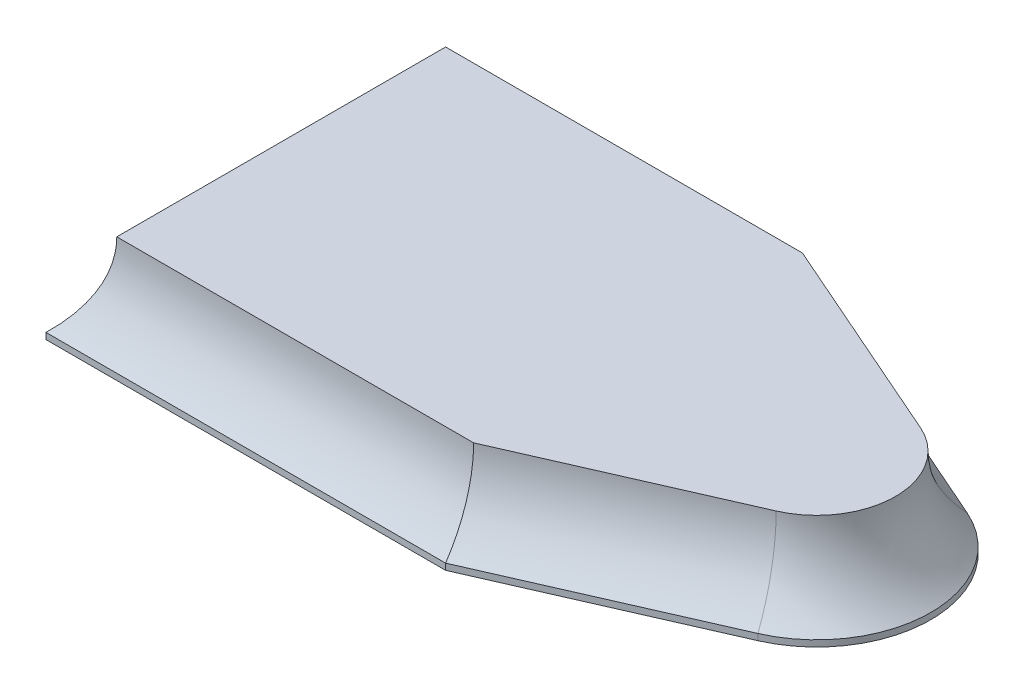
ISO-10303-21;
HEADER;
FILE_DESCRIPTION(('STEP AP214'),'2;1');
FILE_NAME('part.step','',(''),(''),'','','');
FILE_SCHEMA(('AUTOMOTIVE_DESIGN { 1 0 10303 214 1 1 1 1 }'));
ENDSEC;
DATA;
#1=APPLICATION_CONTEXT('core data for automotive mechanical design processes');
#2=APPLICATION_PROTOCOL_DEFINITION('international standard','automotive_design',2000,#1);
#3=PRODUCT_CONTEXT('',#1,'mechanical');
#4=PRODUCT('Part','Part','',(#3));
#5=PRODUCT_RELATED_PRODUCT_CATEGORY('part','',(#4));
#6=PRODUCT_DEFINITION_FORMATION('','',#4);
#7=PRODUCT_DEFINITION_CONTEXT('part definition',#1,'design');
#8=PRODUCT_DEFINITION('design','',#6,#7);
#9=PRODUCT_DEFINITION_SHAPE('','',#8);
#10=(LENGTH_UNIT() NAMED_UNIT(*) SI_UNIT(.MILLI.,.METRE.));
#11=(NAMED_UNIT(*) PLANE_ANGLE_UNIT() SI_UNIT($,.RADIAN.));
#12=(NAMED_UNIT(*) SI_UNIT($,.STERADIAN.) SOLID_ANGLE_UNIT());
#13=UNCERTAINTY_MEASURE_WITH_UNIT(LENGTH_MEASURE(1.E-05),#10,'distance_accuracy_value','');
#14=(GEOMETRIC_REPRESENTATION_CONTEXT(3) GLOBAL_UNCERTAINTY_ASSIGNED_CONTEXT((#13)) GLOBAL_UNIT_ASSIGNED_CONTEXT((#10,
#11,#12)) REPRESENTATION_CONTEXT('',''));
#15=CARTESIAN_POINT('',(0.,0.,0.));
#16=DIRECTION('',(0.,0.,1.));
#17=DIRECTION('',(1.,0.,0.));
#18=AXIS2_PLACEMENT_3D('',#15,#16,#17);
#19=CARTESIAN_POINT('',(7.,0.,-7.));
#20=DIRECTION('',(0.,0.,-1.));
#21=DIRECTION('',(-1.,0.,0.));
#22=AXIS2_PLACEMENT_3D('',#19,#20,#21);
#23=PLANE('',#22);
#24=DIRECTION('',(0.,-1.,0.));
#25=VECTOR('',#24,1.);
#26=CARTESIAN_POINT('',(0.,0.,-7.));
#27=LINE('',#26,#25);
#28=CARTESIAN_POINT('',(0.,0.11,-7.));
#29=VERTEX_POINT('',#28);
#30=CARTESIAN_POINT('',(0.,0.,-7.));
#31=VERTEX_POINT('',#30);
#32=EDGE_CURVE('E179',#29,#31,#27,.T.);
#33=ORIENTED_EDGE('',*,*,#32,.F.);
#34=DIRECTION('',(-1.,0.,0.));
#35=VECTOR('',#34,1.);
#36=CARTESIAN_POINT('',(7.,0.11,-7.));
#37=LINE('',#36,#35);
#38=CARTESIAN_POINT('',(7.,0.11,-7.));
#39=VERTEX_POINT('',#38);
#40=EDGE_CURVE('E144',#39,#29,#37,.T.);
#41=ORIENTED_EDGE('',*,*,#40,.F.);
#42=DIRECTION('',(0.,-1.,0.));
#43=VECTOR('',#42,1.);
#44=CARTESIAN_POINT('',(7.,0.,-7.));
#45=LINE('',#44,#43);
#46=CARTESIAN_POINT('',(7.,0.,-7.));
#47=VERTEX_POINT('',#46);
#48=EDGE_CURVE('E301',#39,#47,#45,.T.);
#49=ORIENTED_EDGE('',*,*,#48,.T.);
#50=DIRECTION('',(-1.,0.,0.));
#51=VECTOR('',#50,1.);
#52=CARTESIAN_POINT('',(7.,0.,-7.));
#53=LINE('',#52,#51);
#54=EDGE_CURVE('E174',#47,#31,#53,.T.);
#55=ORIENTED_EDGE('',*,*,#54,.T.);
#56=EDGE_LOOP('',(#33,#41,#49,#55));
#57=FACE_BOUND('',#56,.T.);
#58=ADVANCED_FACE('F39',(#57),#23,.T.);
#59=CARTESIAN_POINT('',(7.,0.,-7.));
#60=DIRECTION('',(0.,-1.,0.));
#61=DIRECTION('',(0.,0.,-1.));
#62=AXIS2_PLACEMENT_3D('',#59,#60,#61);
#63=PLANE('',#62);
#64=DIRECTION('',(-1.,0.,0.));
#65=VECTOR('',#64,1.);
#66=CARTESIAN_POINT('',(7.,0.,-6.56));
#67=LINE('',#66,#65);
#68=CARTESIAN_POINT('',(6.90773504548328,0.,-6.56));
#69=VERTEX_POINT('',#68);
#70=CARTESIAN_POINT('',(0.440000000000002,0.,-6.56));
#71=VERTEX_POINT('',#70);
#72=EDGE_CURVE('E177',#69,#71,#67,.T.);
#73=ORIENTED_EDGE('',*,*,#72,.T.);
#74=DIRECTION('',(-0.707106781186548,0.,-0.707106781186548));
#75=VECTOR('',#74,1.);
#76=CARTESIAN_POINT('',(0.,0.,-7.));
#77=LINE('',#76,#75);
#78=EDGE_CURVE('E167',#71,#31,#77,.T.);
#79=ORIENTED_EDGE('',*,*,#78,.T.);
#80=ORIENTED_EDGE('',*,*,#54,.F.);
#81=DIRECTION('',(0.205229524628797,0.,-0.978713871476561));
#82=VECTOR('',#81,1.);
#83=CARTESIAN_POINT('',(6.82506599945197,0.,-6.16576168444128));
#84=LINE('',#83,#82);
#85=EDGE_CURVE('E251',#69,#47,#84,.T.);
#86=ORIENTED_EDGE('',*,*,#85,.F.);
#87=EDGE_LOOP('',(#73,#79,#80,#86));
#88=FACE_BOUND('',#87,.T.);
#89=ADVANCED_FACE('F596',(#88),#63,.T.);
#90=CARTESIAN_POINT('',(7.,0.,-6.56));
#91=DIRECTION('',(0.,-0.365652372422994,0.930751493440347));
#92=DIRECTION('',(0.,-0.930751493440347,-0.365652372422994));
#93=AXIS2_PLACEMENT_3D('',#90,#91,#92);
#94=PLANE('',#93);
#95=DIRECTION('',(-1.,0.,0.));
#96=VECTOR('',#95,1.);
#97=CARTESIAN_POINT('',(7.,1.12,-6.12));
#98=LINE('',#97,#96);
#99=CARTESIAN_POINT('',(6.81547009096655,1.12,-6.12));
#100=VERTEX_POINT('',#99);
#101=CARTESIAN_POINT('',(0.880000000000001,1.12,-6.12));
#102=VERTEX_POINT('',#101);
#103=EDGE_CURVE('E154',#100,#102,#98,.T.);
#104=ORIENTED_EDGE('',*,*,#103,.T.);
#105=DIRECTION('',(-0.343414797579954,-0.874146757476248,-0.343414797579954));
#106=VECTOR('',#105,1.);
#107=CARTESIAN_POINT('',(0.388109161793373,-0.132085769980507,-6.61189083820663));
#108=LINE('',#107,#106);
#109=EDGE_CURVE('E187',#102,#71,#108,.T.);
#110=ORIENTED_EDGE('',*,*,#109,.T.);
#111=ORIENTED_EDGE('',*,*,#72,.F.);
#112=DIRECTION('',(0.0764503742779721,-0.928027544584215,-0.364582249658085));
#113=VECTOR('',#112,1.);
#114=CARTESIAN_POINT('',(6.8839996077667,0.288123376658069,-6.44680867345576));
#115=LINE('',#114,#113);
#116=EDGE_CURVE('E189',#100,#69,#115,.T.);
#117=ORIENTED_EDGE('',*,*,#116,.F.);
#118=EDGE_LOOP('',(#104,#110,#111,#117));
#119=FACE_BOUND('',#118,.T.);
#120=ADVANCED_FACE('F185',(#119),#94,.T.);
#121=CARTESIAN_POINT('',(7.,1.55762008419297,-8.37999858399968));
#122=DIRECTION('',(-1.,0.,0.));
#123=DIRECTION('',(0.,0.,1.));
#124=AXIS2_PLACEMENT_3D('',#121,#122,#123);
#125=CYLINDRICAL_SURFACE('',#124,2.);
#126=ORIENTED_EDGE('',*,*,#40,.T.);
#127=CARTESIAN_POINT('',(-1.37999858399969,1.55762008419297,-8.37999858399968));
#128=DIRECTION('',(-0.707106781186547,0.,0.707106781186547));
#129=DIRECTION('',(0.707106781186548,0.,0.707106781186548));
#130=AXIS2_PLACEMENT_3D('',#127,#128,#129);
#131=ELLIPSE('',#130,2.82842712474619,2.);
#132=CARTESIAN_POINT('',(0.620000000000001,1.56,-6.38));
#133=VERTEX_POINT('',#132);
#134=EDGE_CURVE('E141',#29,#133,#131,.T.);
#135=ORIENTED_EDGE('',*,*,#134,.T.);
#136=DIRECTION('',(-1.,0.,0.));
#137=VECTOR('',#136,1.);
#138=CARTESIAN_POINT('',(7.,1.56,-6.38));
#139=LINE('',#138,#137);
#140=CARTESIAN_POINT('',(6.8699902913628,1.56,-6.38));
#141=VERTEX_POINT('',#140);
#142=EDGE_CURVE('E43',#141,#133,#139,.T.);
#143=ORIENTED_EDGE('',*,*,#142,.F.);
#144=CARTESIAN_POINT('',(7.28937615133153,1.55762008419297,-8.37999858399969));
#145=DIRECTION('',(-0.978713871476561,0.,-0.205229524628797));
#146=DIRECTION('',(0.205229524628797,0.,-0.978713871476561));
#147=AXIS2_PLACEMENT_3D('',#144,#145,#146);
#148=ELLIPSE('',#147,2.04349816456841,2.);
#149=EDGE_CURVE('E149',#39,#141,#148,.T.);
#150=ORIENTED_EDGE('',*,*,#149,.F.);
#151=EDGE_LOOP('',(#126,#135,#143,#150));
#152=FACE_BOUND('',#151,.T.);
#153=ADVANCED_FACE('F41',(#152),#125,.F.);
#154=CARTESIAN_POINT('',(0.,0.,-7.));
#155=DIRECTION('',(-1.,0.,0.));
#156=DIRECTION('',(0.,0.,1.));
#157=AXIS2_PLACEMENT_3D('',#154,#155,#156);
#158=PLANE('',#157);
#159=DIRECTION('',(0.,-1.,0.));
#160=VECTOR('',#159,1.);
#161=CARTESIAN_POINT('',(0.,0.,0.));
#162=LINE('',#161,#160);
#163=CARTESIAN_POINT('',(0.,0.11,0.));
#164=VERTEX_POINT('',#163);
#165=CARTESIAN_POINT('',(0.,0.,0.));
#166=VERTEX_POINT('',#165);
#167=EDGE_CURVE('E223',#164,#166,#162,.T.);
#168=ORIENTED_EDGE('',*,*,#167,.F.);
#169=DIRECTION('',(0.,0.,1.));
#170=VECTOR('',#169,1.);
#171=CARTESIAN_POINT('',(0.,0.11,-7.));
#172=LINE('',#171,#170);
#173=EDGE_CURVE('E164',#29,#164,#172,.T.);
#174=ORIENTED_EDGE('',*,*,#173,.F.);
#175=ORIENTED_EDGE('',*,*,#32,.T.);
#176=DIRECTION('',(0.,0.,1.));
#177=VECTOR('',#176,1.);
#178=CARTESIAN_POINT('',(0.,0.,-7.));
#179=LINE('',#178,#177);
#180=EDGE_CURVE('E324',#31,#166,#179,.T.);
#181=ORIENTED_EDGE('',*,*,#180,.T.);
#182=EDGE_LOOP('',(#168,#174,#175,#181));
#183=FACE_BOUND('',#182,.T.);
#184=ADVANCED_FACE('F386',(#183),#158,.T.);
#185=CARTESIAN_POINT('',(0.,0.,-7.));
#186=DIRECTION('',(0.,-1.,0.));
#187=DIRECTION('',(0.,0.,-1.));
#188=AXIS2_PLACEMENT_3D('',#185,#186,#187);
#189=PLANE('',#188);
#190=DIRECTION('',(0.,0.,1.));
#191=VECTOR('',#190,1.);
#192=CARTESIAN_POINT('',(0.440000000000001,0.,-7.));
#193=LINE('',#192,#191);
#194=CARTESIAN_POINT('',(0.440000000000001,0.,-0.440000000000002));
#195=VERTEX_POINT('',#194);
#196=EDGE_CURVE('E170',#71,#195,#193,.T.);
#197=ORIENTED_EDGE('',*,*,#196,.T.);
#198=DIRECTION('',(-0.707106781186548,0.,0.707106781186548));
#199=VECTOR('',#198,1.);
#200=CARTESIAN_POINT('',(0.,0.,0.));
#201=LINE('',#200,#199);
#202=EDGE_CURVE('E216',#195,#166,#201,.T.);
#203=ORIENTED_EDGE('',*,*,#202,.T.);
#204=ORIENTED_EDGE('',*,*,#180,.F.);
#205=ORIENTED_EDGE('',*,*,#78,.F.);
#206=EDGE_LOOP('',(#197,#203,#204,#205));
#207=FACE_BOUND('',#206,.T.);
#208=ADVANCED_FACE('F331',(#207),#189,.T.);
#209=CARTESIAN_POINT('',(0.440000000000001,0.,-7.));
#210=DIRECTION('',(0.930751493440347,-0.365652372422994,0.));
#211=DIRECTION('',(0.365652372422994,0.930751493440347,0.));
#212=AXIS2_PLACEMENT_3D('',#209,#210,#211);
#213=PLANE('',#212);
#214=DIRECTION('',(0.,0.,1.));
#215=VECTOR('',#214,1.);
#216=CARTESIAN_POINT('',(0.880000000000001,1.12,-7.));
#217=LINE('',#216,#215);
#218=CARTESIAN_POINT('',(0.88,1.12,-0.880000000000001));
#219=VERTEX_POINT('',#218);
#220=EDGE_CURVE('E165',#102,#219,#217,.T.);
#221=ORIENTED_EDGE('',*,*,#220,.T.);
#222=DIRECTION('',(-0.343414797579954,-0.874146757476248,0.343414797579954));
#223=VECTOR('',#222,1.);
#224=CARTESIAN_POINT('',(0.388109161793372,-0.132085769980507,-0.388109161793372));
#225=LINE('',#224,#223);
#226=EDGE_CURVE('E213',#219,#195,#225,.T.);
#227=ORIENTED_EDGE('',*,*,#226,.T.);
#228=ORIENTED_EDGE('',*,*,#196,.F.);
#229=ORIENTED_EDGE('',*,*,#109,.F.);
#230=EDGE_LOOP('',(#221,#227,#228,#229));
#231=FACE_BOUND('',#230,.T.);
#232=ADVANCED_FACE('F196',(#231),#213,.T.);
#233=CARTESIAN_POINT('',(-1.37999858399969,1.55762008419297,-7.));
#234=DIRECTION('',(0.,0.,1.));
#235=DIRECTION('',(1.,0.,0.));
#236=AXIS2_PLACEMENT_3D('',#233,#234,#235);
#237=CYLINDRICAL_SURFACE('',#236,2.);
#238=ORIENTED_EDGE('',*,*,#173,.T.);
#239=CARTESIAN_POINT('',(-1.37999858399969,1.55762008419297,1.37999858399969));
#240=DIRECTION('',(0.707106781186548,0.,0.707106781186548));
#241=DIRECTION('',(0.707106781186548,0.,-0.707106781186548));
#242=AXIS2_PLACEMENT_3D('',#239,#240,#241);
#243=ELLIPSE('',#242,2.82842712474619,2.);
#244=CARTESIAN_POINT('',(0.62,1.56,-0.620000000000001));
#245=VERTEX_POINT('',#244);
#246=EDGE_CURVE('E163',#164,#245,#243,.T.);
#247=ORIENTED_EDGE('',*,*,#246,.T.);
#248=DIRECTION('',(0.,0.,1.));
#249=VECTOR('',#248,1.);
#250=CARTESIAN_POINT('',(0.62,1.56,-7.));
#251=LINE('',#250,#249);
#252=EDGE_CURVE('E157',#133,#245,#251,.T.);
#253=ORIENTED_EDGE('',*,*,#252,.F.);
#254=ORIENTED_EDGE('',*,*,#134,.F.);
#255=EDGE_LOOP('',(#238,#247,#253,#254));
#256=FACE_BOUND('',#255,.T.);
#257=ADVANCED_FACE('F161',(#256),#237,.F.);
#258=CARTESIAN_POINT('',(7.,0.,0.));
#259=DIRECTION('',(0.,-1.,0.));
#260=DIRECTION('',(0.,0.,-1.));
#261=AXIS2_PLACEMENT_3D('',#258,#259,#260);
#262=PLANE('',#261);
#263=DIRECTION('',(0.205229524628797,0.,0.978713871476561));
#264=VECTOR('',#263,1.);
#265=CARTESIAN_POINT('',(6.70516589554447,0.,-1.40602687813521));
#266=LINE('',#265,#264);
#267=CARTESIAN_POINT('',(6.90773504548328,0.,-0.44));
#268=VERTEX_POINT('',#267);
#269=CARTESIAN_POINT('',(7.,0.,0.));
#270=VERTEX_POINT('',#269);
#271=EDGE_CURVE('E355',#268,#270,#266,.T.);
#272=ORIENTED_EDGE('',*,*,#271,.F.);
#273=DIRECTION('',(0.915761684441276,0.,-0.401721965181489));
#274=VECTOR('',#273,1.);
#275=CARTESIAN_POINT('',(6.82324233532015,0.,-0.402935141154161));
#276=LINE('',#275,#274);
#277=CARTESIAN_POINT('',(10.6266862656831,0.,-2.07141177227161));
#278=VERTEX_POINT('',#277);
#279=EDGE_CURVE('E235',#268,#278,#276,.T.);
#280=ORIENTED_EDGE('',*,*,#279,.T.);
#281=DIRECTION('',(-0.401721965181489,0.,-0.915761684441276));
#282=VECTOR('',#281,1.);
#283=CARTESIAN_POINT('',(10.803443930363,0.,-1.66847663111745));
#284=LINE('',#283,#282);
#285=CARTESIAN_POINT('',(10.803443930363,0.,-1.66847663111745));
#286=VERTEX_POINT('',#285);
#287=EDGE_CURVE('E238',#286,#278,#284,.T.);
#288=ORIENTED_EDGE('',*,*,#287,.F.);
#289=DIRECTION('',(0.915761684441276,0.,-0.401721965181489));
#290=VECTOR('',#289,1.);
#291=CARTESIAN_POINT('',(7.,0.,0.));
#292=LINE('',#291,#290);
#293=EDGE_CURVE('E248',#270,#286,#292,.T.);
#294=ORIENTED_EDGE('',*,*,#293,.F.);
#295=EDGE_LOOP('',(#272,#280,#288,#294));
#296=FACE_BOUND('',#295,.T.);
#297=ADVANCED_FACE('F381',(#296),#262,.T.);
#298=CARTESIAN_POINT('',(6.82324233532015,0.,-0.402935141154161));
#299=DIRECTION('',(-0.373903319040462,-0.365652372422994,-0.852346555429165));
#300=DIRECTION('',(-0.915761684441276,0.,0.401721965181488));
#301=AXIS2_PLACEMENT_3D('',#298,#299,#300);
#302=PLANE('',#301);
#303=DIRECTION('',(0.0764503742779721,-0.928027544584215,0.364582249658085));
#304=VECTOR('',#303,1.);
#305=CARTESIAN_POINT('',(6.86736168465648,0.490090352971604,-0.632535495810273));
#306=LINE('',#305,#304);
#307=CARTESIAN_POINT('',(6.81547009096655,1.12,-0.88));
#308=VERTEX_POINT('',#307);
#309=EDGE_CURVE('E346',#308,#268,#306,.T.);
#310=ORIENTED_EDGE('',*,*,#309,.F.);
#311=DIRECTION('',(0.915761684441276,0.,-0.401721965181489));
#312=VECTOR('',#311,1.);
#313=CARTESIAN_POINT('',(6.64648467064029,1.12,-0.805870282308323));
#314=LINE('',#313,#312);
#315=CARTESIAN_POINT('',(10.4499286010033,1.12,-2.47434691342577));
#316=VERTEX_POINT('',#315);
#317=EDGE_CURVE('E239',#308,#316,#314,.T.);
#318=ORIENTED_EDGE('',*,*,#317,.T.);
#319=DIRECTION('',(-0.146890589623038,0.930751493440347,-0.334850432490029));
#320=VECTOR('',#319,1.);
#321=CARTESIAN_POINT('',(10.6266862656831,0.,-2.07141177227161));
#322=LINE('',#321,#320);
#323=EDGE_CURVE('E237',#278,#316,#322,.T.);
#324=ORIENTED_EDGE('',*,*,#323,.F.);
#325=ORIENTED_EDGE('',*,*,#279,.F.);
#326=EDGE_LOOP('',(#310,#318,#324,#325));
#327=FACE_BOUND('',#326,.T.);
#328=ADVANCED_FACE('F400',(#327),#302,.T.);
#329=CARTESIAN_POINT('',(7.55437574311203,1.55762008419297,1.26374982781013));
#330=DIRECTION('',(0.915761684441276,0.,-0.401721965181489));
#331=DIRECTION('',(-0.401721965181489,0.,-0.915761684441276));
#332=AXIS2_PLACEMENT_3D('',#329,#330,#331);
#333=CYLINDRICAL_SURFACE('',#332,2.);
#334=CARTESIAN_POINT('',(7.28937615133153,1.55762008419297,1.37999858399969));
#335=DIRECTION('',(0.978713871476561,0.,-0.205229524628797));
#336=DIRECTION('',(0.205229524628797,0.,0.978713871476561));
#337=AXIS2_PLACEMENT_3D('',#334,#335,#336);
#338=ELLIPSE('',#337,2.04349816456841,2.);
#339=CARTESIAN_POINT('',(7.,0.11,0.));
#340=VERTEX_POINT('',#339);
#341=CARTESIAN_POINT('',(6.8699902913628,1.56,-0.619999999999999));
#342=VERTEX_POINT('',#341);
#343=EDGE_CURVE('E11',#340,#342,#338,.T.);
#344=ORIENTED_EDGE('',*,*,#343,.F.);
#345=DIRECTION('',(0.915761684441276,0.,-0.401721965181489));
#346=VECTOR('',#345,1.);
#347=CARTESIAN_POINT('',(7.,0.11,0.));
#348=LINE('',#347,#346);
#349=CARTESIAN_POINT('',(10.803443930363,0.11,-1.66847663111745));
#350=VERTEX_POINT('',#349);
#351=EDGE_CURVE('E291',#340,#350,#348,.T.);
#352=ORIENTED_EDGE('',*,*,#351,.T.);
#353=CARTESIAN_POINT('',(11.357819673475,1.55762008419297,-0.40472680330732));
#354=DIRECTION('',(-0.915761684441276,0.,0.401721965181489));
#355=DIRECTION('',(-0.401721965181489,0.,-0.915761684441276));
#356=AXIS2_PLACEMENT_3D('',#353,#354,#355);
#357=CIRCLE('',#356,2.);
#358=CARTESIAN_POINT('',(10.5543763119505,1.56,-2.23624887547104));
#359=VERTEX_POINT('',#358);
#360=EDGE_CURVE('E244',#359,#350,#357,.T.);
#361=ORIENTED_EDGE('',*,*,#360,.F.);
#362=DIRECTION('',(0.915761684441276,0.,-0.401721965181489));
#363=VECTOR('',#362,1.);
#364=CARTESIAN_POINT('',(6.75093238158748,1.56,-0.567772244353591));
#365=LINE('',#364,#363);
#366=EDGE_CURVE('E242',#342,#359,#365,.T.);
#367=ORIENTED_EDGE('',*,*,#366,.F.);
#368=EDGE_LOOP('',(#344,#352,#361,#367));
#369=FACE_BOUND('',#368,.T.);
#370=ADVANCED_FACE('F417',(#369),#333,.F.);
#371=CARTESIAN_POINT('',(7.,0.,0.));
#372=DIRECTION('',(0.401721965181489,0.,0.915761684441276));
#373=DIRECTION('',(0.915761684441276,0.,-0.401721965181489));
#374=AXIS2_PLACEMENT_3D('',#371,#372,#373);
#375=PLANE('',#374);
#376=DIRECTION('',(0.,-1.,0.));
#377=VECTOR('',#376,1.);
#378=CARTESIAN_POINT('',(10.803443930363,0.,-1.66847663111745));
#379=LINE('',#378,#377);
#380=EDGE_CURVE('E262',#350,#286,#379,.T.);
#381=ORIENTED_EDGE('',*,*,#380,.F.);
#382=ORIENTED_EDGE('',*,*,#351,.F.);
#383=DIRECTION('',(0.,-1.,0.));
#384=VECTOR('',#383,1.);
#385=CARTESIAN_POINT('',(7.,0.,0.));
#386=LINE('',#385,#384);
#387=EDGE_CURVE('E359',#340,#270,#386,.T.);
#388=ORIENTED_EDGE('',*,*,#387,.T.);
#389=ORIENTED_EDGE('',*,*,#293,.T.);
#390=EDGE_LOOP('',(#381,#382,#388,#389));
#391=FACE_BOUND('',#390,.T.);
#392=ADVANCED_FACE('F374',(#391),#375,.T.);
#393=CARTESIAN_POINT('',(10.803443930363,0.,-1.66847663111745));
#394=DIRECTION('',(0.,-1.,0.));
#395=DIRECTION('',(0.,0.,-1.));
#396=AXIS2_PLACEMENT_3D('',#393,#394,#395);
#397=PLANE('',#396);
#398=CARTESIAN_POINT('',(10.,0.,-3.5));
#399=DIRECTION('',(0.,1.,0.));
#400=DIRECTION('',(0.401721965181489,0.,0.915761684441276));
#401=AXIS2_PLACEMENT_3D('',#398,#399,#400);
#402=CIRCLE('',#401,1.56);
#403=CARTESIAN_POINT('',(10.6266862656831,0.,-4.92858822772839));
#404=VERTEX_POINT('',#403);
#405=EDGE_CURVE('E255',#278,#404,#402,.T.);
#406=ORIENTED_EDGE('',*,*,#405,.T.);
#407=DIRECTION('',(-0.401721965181488,0.,0.915761684441276));
#408=VECTOR('',#407,1.);
#409=CARTESIAN_POINT('',(10.803443930363,0.,-5.33152336888255));
#410=LINE('',#409,#408);
#411=CARTESIAN_POINT('',(10.803443930363,0.,-5.33152336888255));
#412=VERTEX_POINT('',#411);
#413=EDGE_CURVE('E252',#412,#404,#410,.T.);
#414=ORIENTED_EDGE('',*,*,#413,.F.);
#415=CARTESIAN_POINT('',(10.,0.,-3.5));
#416=DIRECTION('',(0.,1.,0.));
#417=DIRECTION('',(0.401721965181488,0.,0.915761684441276));
#418=AXIS2_PLACEMENT_3D('',#415,#416,#417);
#419=CIRCLE('',#418,2.);
#420=EDGE_CURVE('E256',#286,#412,#419,.T.);
#421=ORIENTED_EDGE('',*,*,#420,.F.);
#422=ORIENTED_EDGE('',*,*,#287,.T.);
#423=EDGE_LOOP('',(#406,#414,#421,#422));
#424=FACE_BOUND('',#423,.T.);
#425=ADVANCED_FACE('F412',(#424),#397,.T.);
#426=CARTESIAN_POINT('',(10.,0.,-3.5));
#427=DIRECTION('',(0.,-1.,0.));
#428=DIRECTION('',(0.,0.,-1.));
#429=AXIS2_PLACEMENT_3D('',#426,#427,#428);
#430=CONICAL_SURFACE('',#429,1.56,0.374333616007584);
#431=CARTESIAN_POINT('',(10.,1.12,-3.5));
#432=DIRECTION('',(0.,1.,0.));
#433=DIRECTION('',(0.401721965181488,0.,0.915761684441276));
#434=AXIS2_PLACEMENT_3D('',#431,#432,#433);
#435=CIRCLE('',#434,1.12);
#436=CARTESIAN_POINT('',(10.4499286010033,1.12,-4.52565308657423));
#437=VERTEX_POINT('',#436);
#438=EDGE_CURVE('E272',#316,#437,#435,.T.);
#439=ORIENTED_EDGE('',*,*,#438,.T.);
#440=DIRECTION('',(-0.146890589623038,0.930751493440347,0.334850432490029));
#441=VECTOR('',#440,1.);
#442=CARTESIAN_POINT('',(10.6266862656831,0.,-4.92858822772839));
#443=LINE('',#442,#441);
#444=EDGE_CURVE('E259',#404,#437,#443,.T.);
#445=ORIENTED_EDGE('',*,*,#444,.F.);
#446=ORIENTED_EDGE('',*,*,#405,.F.);
#447=ORIENTED_EDGE('',*,*,#323,.T.);
#448=EDGE_LOOP('',(#439,#445,#446,#447));
#449=FACE_BOUND('',#448,.T.);
#450=ADVANCED_FACE('F404',(#449),#430,.F.);
#451=CARTESIAN_POINT('',(10.,1.55762008419297,-3.5));
#452=DIRECTION('',(0.,1.,0.));
#453=DIRECTION('',(0.,0.,1.));
#454=AXIS2_PLACEMENT_3D('',#451,#452,#453);
#455=TOROIDAL_SURFACE('',#454,3.37999858399969,2.);
#456=CARTESIAN_POINT('',(10.,0.11,-3.5));
#457=DIRECTION('',(0.,1.,0.));
#458=DIRECTION('',(0.401721965181488,0.,0.915761684441276));
#459=AXIS2_PLACEMENT_3D('',#456,#457,#458);
#460=CIRCLE('',#459,2.);
#461=CARTESIAN_POINT('',(10.803443930363,0.11,-5.33152336888255));
#462=VERTEX_POINT('',#461);
#463=EDGE_CURVE('E295',#350,#462,#460,.T.);
#464=ORIENTED_EDGE('',*,*,#463,.T.);
#465=CARTESIAN_POINT('',(11.357819673475,1.55762008419297,-6.59527319669268));
#466=DIRECTION('',(0.915761684441276,0.,0.401721965181488));
#467=DIRECTION('',(-0.401721965181488,0.,0.915761684441276));
#468=AXIS2_PLACEMENT_3D('',#465,#466,#467);
#469=CIRCLE('',#468,2.);
#470=CARTESIAN_POINT('',(10.5543763119505,1.56,-4.76375112452896));
#471=VERTEX_POINT('',#470);
#472=EDGE_CURVE('E288',#471,#462,#469,.T.);
#473=ORIENTED_EDGE('',*,*,#472,.F.);
#474=CARTESIAN_POINT('',(10.,1.56,-3.5));
#475=DIRECTION('',(0.,1.,0.));
#476=DIRECTION('',(0.401721965181488,0.,0.915761684441276));
#477=AXIS2_PLACEMENT_3D('',#474,#475,#476);
#478=CIRCLE('',#477,1.38);
#479=EDGE_CURVE('E285',#359,#471,#478,.T.);
#480=ORIENTED_EDGE('',*,*,#479,.F.);
#481=ORIENTED_EDGE('',*,*,#360,.T.);
#482=EDGE_LOOP('',(#464,#473,#480,#481));
#483=FACE_BOUND('',#482,.T.);
#484=ADVANCED_FACE('F420',(#483),#455,.F.);
#485=CARTESIAN_POINT('',(10.,0.,-3.5));
#486=DIRECTION('',(0.,1.,0.));
#487=DIRECTION('',(0.,0.,1.));
#488=AXIS2_PLACEMENT_3D('',#485,#486,#487);
#489=CYLINDRICAL_SURFACE('',#488,2.);
#490=DIRECTION('',(0.,-1.,0.));
#491=VECTOR('',#490,1.);
#492=CARTESIAN_POINT('',(10.803443930363,0.,-5.33152336888255));
#493=LINE('',#492,#491);
#494=EDGE_CURVE('E267',#462,#412,#493,.T.);
#495=ORIENTED_EDGE('',*,*,#494,.F.);
#496=ORIENTED_EDGE('',*,*,#463,.F.);
#497=ORIENTED_EDGE('',*,*,#380,.T.);
#498=ORIENTED_EDGE('',*,*,#420,.T.);
#499=EDGE_LOOP('',(#495,#496,#497,#498));
#500=FACE_BOUND('',#499,.T.);
#501=ADVANCED_FACE('F415',(#500),#489,.T.);
#502=CARTESIAN_POINT('',(10.803443930363,0.,-5.33152336888255));
#503=DIRECTION('',(0.401721965181489,0.,-0.915761684441276));
#504=DIRECTION('',(-0.915761684441276,0.,-0.401721965181489));
#505=AXIS2_PLACEMENT_3D('',#502,#503,#504);
#506=PLANE('',#505);
#507=ORIENTED_EDGE('',*,*,#48,.F.);
#508=DIRECTION('',(-0.915761684441276,0.,-0.401721965181489));
#509=VECTOR('',#508,1.);
#510=CARTESIAN_POINT('',(10.803443930363,0.11,-5.33152336888255));
#511=LINE('',#510,#509);
#512=EDGE_CURVE('E298',#462,#39,#511,.T.);
#513=ORIENTED_EDGE('',*,*,#512,.F.);
#514=ORIENTED_EDGE('',*,*,#494,.T.);
#515=DIRECTION('',(-0.915761684441276,0.,-0.401721965181489));
#516=VECTOR('',#515,1.);
#517=CARTESIAN_POINT('',(10.803443930363,0.,-5.33152336888255));
#518=LINE('',#517,#516);
#519=EDGE_CURVE('E263',#412,#47,#518,.T.);
#520=ORIENTED_EDGE('',*,*,#519,.T.);
#521=EDGE_LOOP('',(#507,#513,#514,#520));
#522=FACE_BOUND('',#521,.T.);
#523=ADVANCED_FACE('F428',(#522),#506,.T.);
#524=CARTESIAN_POINT('',(10.803443930363,0.,-5.33152336888255));
#525=DIRECTION('',(0.,-1.,0.));
#526=DIRECTION('',(0.,0.,-1.));
#527=AXIS2_PLACEMENT_3D('',#524,#525,#526);
#528=PLANE('',#527);
#529=DIRECTION('',(-0.915761684441276,0.,-0.401721965181489));
#530=VECTOR('',#529,1.);
#531=CARTESIAN_POINT('',(10.6266862656831,0.,-4.92858822772839));
#532=LINE('',#531,#530);
#533=EDGE_CURVE('E266',#404,#69,#532,.T.);
#534=ORIENTED_EDGE('',*,*,#533,.T.);
#535=ORIENTED_EDGE('',*,*,#85,.T.);
#536=ORIENTED_EDGE('',*,*,#519,.F.);
#537=ORIENTED_EDGE('',*,*,#413,.T.);
#538=EDGE_LOOP('',(#534,#535,#536,#537));
#539=FACE_BOUND('',#538,.T.);
#540=ADVANCED_FACE('F409',(#539),#528,.T.);
#541=CARTESIAN_POINT('',(10.6266862656831,0.,-4.92858822772839));
#542=DIRECTION('',(-0.373903319040462,-0.365652372422994,0.852346555429165));
#543=DIRECTION('',(0.915761684441276,0.,0.401721965181489));
#544=AXIS2_PLACEMENT_3D('',#541,#542,#543);
#545=PLANE('',#544);
#546=DIRECTION('',(-0.915761684441276,0.,-0.401721965181489));
#547=VECTOR('',#546,1.);
#548=CARTESIAN_POINT('',(10.4499286010033,1.12,-4.52565308657423));
#549=LINE('',#548,#547);
#550=EDGE_CURVE('E317',#437,#100,#549,.T.);
#551=ORIENTED_EDGE('',*,*,#550,.T.);
#552=ORIENTED_EDGE('',*,*,#116,.T.);
#553=ORIENTED_EDGE('',*,*,#533,.F.);
#554=ORIENTED_EDGE('',*,*,#444,.T.);
#555=EDGE_LOOP('',(#551,#552,#553,#554));
#556=FACE_BOUND('',#555,.T.);
#557=ADVANCED_FACE('F407',(#556),#545,.T.);
#558=CARTESIAN_POINT('',(11.357819673475,1.55762008419297,-6.59527319669268));
#559=DIRECTION('',(-0.915761684441276,0.,-0.401721965181489));
#560=DIRECTION('',(-0.401721965181489,0.,0.915761684441276));
#561=AXIS2_PLACEMENT_3D('',#558,#559,#560);
#562=CYLINDRICAL_SURFACE('',#561,2.);
#563=ORIENTED_EDGE('',*,*,#512,.T.);
#564=ORIENTED_EDGE('',*,*,#149,.T.);
#565=DIRECTION('',(-0.915761684441276,0.,-0.401721965181489));
#566=VECTOR('',#565,1.);
#567=CARTESIAN_POINT('',(10.5543763119505,1.56,-4.76375112452896));
#568=LINE('',#567,#566);
#569=EDGE_CURVE('E302',#471,#141,#568,.T.);
#570=ORIENTED_EDGE('',*,*,#569,.F.);
#571=ORIENTED_EDGE('',*,*,#472,.T.);
#572=EDGE_LOOP('',(#563,#564,#570,#571));
#573=FACE_BOUND('',#572,.T.);
#574=ADVANCED_FACE('F423',(#573),#562,.F.);
#575=CARTESIAN_POINT('',(0.,0.,0.));
#576=DIRECTION('',(0.,0.,1.));
#577=DIRECTION('',(1.,0.,0.));
#578=AXIS2_PLACEMENT_3D('',#575,#576,#577);
#579=PLANE('',#578);
#580=ORIENTED_EDGE('',*,*,#387,.F.);
#581=DIRECTION('',(1.,0.,0.));
#582=VECTOR('',#581,1.);
#583=CARTESIAN_POINT('',(0.,0.11,0.));
#584=LINE('',#583,#582);
#585=EDGE_CURVE('E234',#164,#340,#584,.T.);
#586=ORIENTED_EDGE('',*,*,#585,.F.);
#587=ORIENTED_EDGE('',*,*,#167,.T.);
#588=DIRECTION('',(1.,0.,0.));
#589=VECTOR('',#588,1.);
#590=CARTESIAN_POINT('',(0.,0.,0.));
#591=LINE('',#590,#589);
#592=EDGE_CURVE('E228',#166,#270,#591,.T.);
#593=ORIENTED_EDGE('',*,*,#592,.T.);
#594=EDGE_LOOP('',(#580,#586,#587,#593));
#595=FACE_BOUND('',#594,.T.);
#596=ADVANCED_FACE('F382',(#595),#579,.T.);
#597=CARTESIAN_POINT('',(0.,0.,0.));
#598=DIRECTION('',(0.,-1.,0.));
#599=DIRECTION('',(0.,0.,-1.));
#600=AXIS2_PLACEMENT_3D('',#597,#598,#599);
#601=PLANE('',#600);
#602=ORIENTED_EDGE('',*,*,#202,.F.);
#603=DIRECTION('',(1.,0.,0.));
#604=VECTOR('',#603,1.);
#605=CARTESIAN_POINT('',(0.,0.,-0.44));
#606=LINE('',#605,#604);
#607=EDGE_CURVE('E224',#195,#268,#606,.T.);
#608=ORIENTED_EDGE('',*,*,#607,.T.);
#609=ORIENTED_EDGE('',*,*,#271,.T.);
#610=ORIENTED_EDGE('',*,*,#592,.F.);
#611=EDGE_LOOP('',(#602,#608,#609,#610));
#612=FACE_BOUND('',#611,.T.);
#613=ADVANCED_FACE('F338',(#612),#601,.T.);
#614=CARTESIAN_POINT('',(0.,0.,-0.44));
#615=DIRECTION('',(0.,-0.365652372422993,-0.930751493440347));
#616=DIRECTION('',(0.,0.930751493440347,-0.365652372422993));
#617=AXIS2_PLACEMENT_3D('',#614,#615,#616);
#618=PLANE('',#617);
#619=ORIENTED_EDGE('',*,*,#226,.F.);
#620=DIRECTION('',(1.,0.,0.));
#621=VECTOR('',#620,1.);
#622=CARTESIAN_POINT('',(0.,1.12,-0.88));
#623=LINE('',#622,#621);
#624=EDGE_CURVE('E227',#219,#308,#623,.T.);
#625=ORIENTED_EDGE('',*,*,#624,.T.);
#626=ORIENTED_EDGE('',*,*,#309,.T.);
#627=ORIENTED_EDGE('',*,*,#607,.F.);
#628=EDGE_LOOP('',(#619,#625,#626,#627));
#629=FACE_BOUND('',#628,.T.);
#630=ADVANCED_FACE('F344',(#629),#618,.T.);
#631=CARTESIAN_POINT('',(0.,1.12,-0.88));
#632=DIRECTION('',(0.,-1.,0.));
#633=DIRECTION('',(0.,0.,-1.));
#634=AXIS2_PLACEMENT_3D('',#631,#632,#633);
#635=PLANE('',#634);
#636=ORIENTED_EDGE('',*,*,#624,.F.);
#637=ORIENTED_EDGE('',*,*,#220,.F.);
#638=ORIENTED_EDGE('',*,*,#103,.F.);
#639=ORIENTED_EDGE('',*,*,#550,.F.);
#640=ORIENTED_EDGE('',*,*,#438,.F.);
#641=ORIENTED_EDGE('',*,*,#317,.F.);
#642=EDGE_LOOP('',(#636,#637,#638,#639,#640,#641));
#643=FACE_BOUND('',#642,.T.);
#644=ADVANCED_FACE('F205',(#643),#635,.T.);
#645=CARTESIAN_POINT('',(0.,1.56,-1.88));
#646=DIRECTION('',(0.,1.,0.));
#647=DIRECTION('',(0.,0.,1.));
#648=AXIS2_PLACEMENT_3D('',#645,#646,#647);
#649=PLANE('',#648);
#650=DIRECTION('',(1.,0.,0.));
#651=VECTOR('',#650,1.);
#652=CARTESIAN_POINT('',(0.,1.56,-0.619999999999999));
#653=LINE('',#652,#651);
#654=EDGE_CURVE('E231',#245,#342,#653,.T.);
#655=ORIENTED_EDGE('',*,*,#654,.T.);
#656=ORIENTED_EDGE('',*,*,#366,.T.);
#657=ORIENTED_EDGE('',*,*,#479,.T.);
#658=ORIENTED_EDGE('',*,*,#569,.T.);
#659=ORIENTED_EDGE('',*,*,#142,.T.);
#660=ORIENTED_EDGE('',*,*,#252,.T.);
#661=EDGE_LOOP('',(#655,#656,#657,#658,#659,#660));
#662=FACE_BOUND('',#661,.T.);
#663=ADVANCED_FACE('F152',(#662),#649,.T.);
#664=CARTESIAN_POINT('',(0.,1.55762008419297,1.37999858399969));
#665=DIRECTION('',(1.,0.,0.));
#666=DIRECTION('',(0.,0.,-1.));
#667=AXIS2_PLACEMENT_3D('',#664,#665,#666);
#668=CYLINDRICAL_SURFACE('',#667,2.);
#669=ORIENTED_EDGE('',*,*,#246,.F.);
#670=ORIENTED_EDGE('',*,*,#585,.T.);
#671=ORIENTED_EDGE('',*,*,#343,.T.);
#672=ORIENTED_EDGE('',*,*,#654,.F.);
#673=EDGE_LOOP('',(#669,#670,#671,#672));
#674=FACE_BOUND('',#673,.T.);
#675=ADVANCED_FACE('F390',(#674),#668,.F.);
#676=CLOSED_SHELL('',(#58,#89,#120,#153,#184,#208,#232,#257,#297,#328,#370,#392,#425,#450,#484,
#501,#523,#540,#557,#574,#596,#613,#630,#644,#663,#675));
#677=MANIFOLD_SOLID_BREP('B2',#676);
#678=ADVANCED_BREP_SHAPE_REPRESENTATION('',(#18,#677),#14);
#679=SHAPE_DEFINITION_REPRESENTATION(#9,#678);
ENDSEC;
END-ISO-10303-21;
